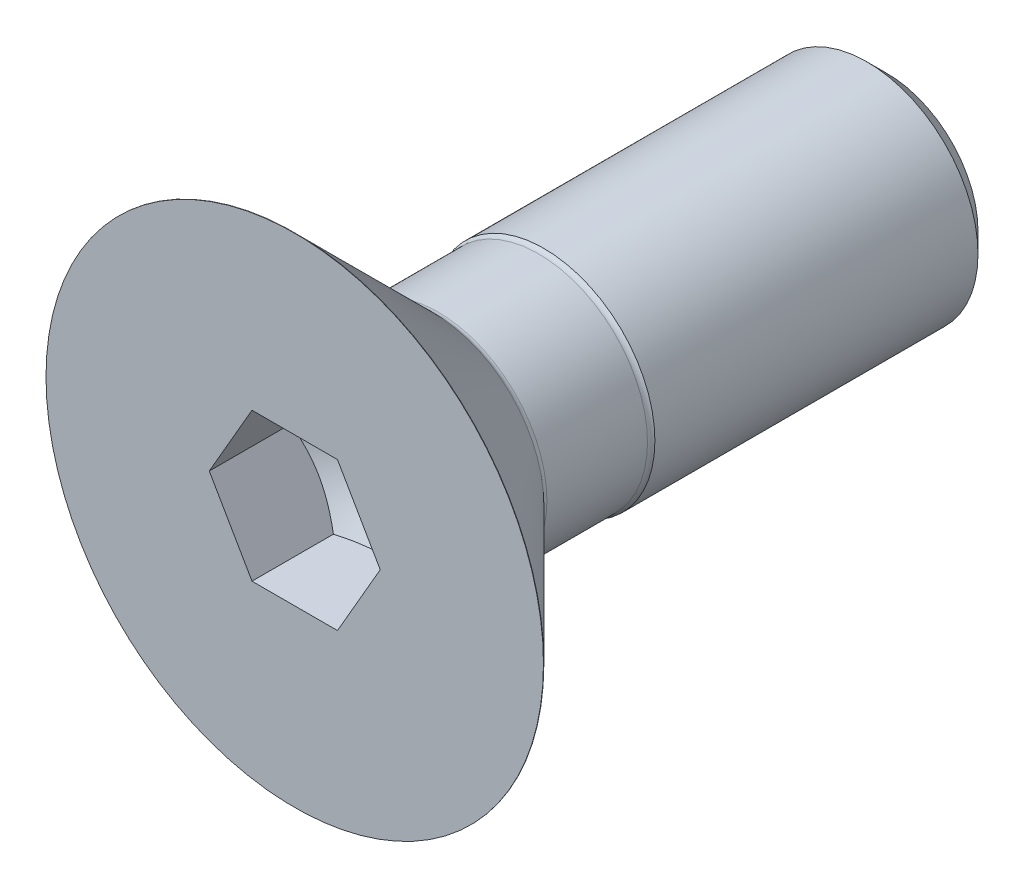
ISO-10303-21;
HEADER;
FILE_DESCRIPTION(('STEP AP214'),'2;1');
FILE_NAME('part.step','',(''),(''),'','','');
FILE_SCHEMA(('AUTOMOTIVE_DESIGN { 1 0 10303 214 1 1 1 1 }'));
ENDSEC;
DATA;
#1=APPLICATION_CONTEXT('core data for automotive mechanical design processes');
#2=APPLICATION_PROTOCOL_DEFINITION('international standard','automotive_design',2000,#1);
#3=PRODUCT_CONTEXT('',#1,'mechanical');
#4=PRODUCT('Part','Part','',(#3));
#5=PRODUCT_RELATED_PRODUCT_CATEGORY('part','',(#4));
#6=PRODUCT_DEFINITION_FORMATION('','',#4);
#7=PRODUCT_DEFINITION_CONTEXT('part definition',#1,'design');
#8=PRODUCT_DEFINITION('design','',#6,#7);
#9=PRODUCT_DEFINITION_SHAPE('','',#8);
#10=(LENGTH_UNIT() NAMED_UNIT(*) SI_UNIT(.MILLI.,.METRE.));
#11=(NAMED_UNIT(*) PLANE_ANGLE_UNIT() SI_UNIT($,.RADIAN.));
#12=(NAMED_UNIT(*) SI_UNIT($,.STERADIAN.) SOLID_ANGLE_UNIT());
#13=UNCERTAINTY_MEASURE_WITH_UNIT(LENGTH_MEASURE(1.E-05),#10,'distance_accuracy_value','');
#14=(GEOMETRIC_REPRESENTATION_CONTEXT(3) GLOBAL_UNCERTAINTY_ASSIGNED_CONTEXT((#13)) GLOBAL_UNIT_ASSIGNED_CONTEXT((#10,
#11,#12)) REPRESENTATION_CONTEXT('',''));
#15=CARTESIAN_POINT('',(0.,0.,0.));
#16=DIRECTION('',(0.,0.,1.));
#17=DIRECTION('',(1.,0.,0.));
#18=AXIS2_PLACEMENT_3D('',#15,#16,#17);
#19=CARTESIAN_POINT('',(0.,6.72,0.));
#20=DIRECTION('',(0.,0.,-1.));
#21=DIRECTION('',(-1.,0.,0.));
#22=AXIS2_PLACEMENT_3D('',#19,#20,#21);
#23=PLANE('',#22);
#24=CARTESIAN_POINT('',(0.,0.,0.));
#25=DIRECTION('',(0.,0.,1.));
#26=DIRECTION('',(1.,0.,0.));
#27=AXIS2_PLACEMENT_3D('',#24,#25,#26);
#28=CIRCLE('',#27,6.72);
#29=CARTESIAN_POINT('',(6.72,0.,0.));
#30=VERTEX_POINT('',#29);
#31=EDGE_CURVE('E107',#30,#30,#28,.T.);
#32=ORIENTED_EDGE('',*,*,#31,.T.);
#33=EDGE_LOOP('',(#32));
#34=FACE_BOUND('',#33,.T.);
#35=DIRECTION('',(0.5,-0.866025403784439,0.));
#36=VECTOR('',#35,1.);
#37=CARTESIAN_POINT('',(1.1547,1.99999906749978,0.));
#38=LINE('',#37,#36);
#39=CARTESIAN_POINT('',(1.1547,1.99999906749978,0.));
#40=VERTEX_POINT('',#39);
#41=CARTESIAN_POINT('',(2.3094,0.,0.));
#42=VERTEX_POINT('',#41);
#43=EDGE_CURVE('E31',#40,#42,#38,.T.);
#44=ORIENTED_EDGE('',*,*,#43,.T.);
#45=DIRECTION('',(-0.5,-0.866025403784439,0.));
#46=VECTOR('',#45,1.);
#47=CARTESIAN_POINT('',(2.3094,0.,0.));
#48=LINE('',#47,#46);
#49=CARTESIAN_POINT('',(1.1547,-1.99999906749978,0.));
#50=VERTEX_POINT('',#49);
#51=EDGE_CURVE('E181',#42,#50,#48,.T.);
#52=ORIENTED_EDGE('',*,*,#51,.T.);
#53=DIRECTION('',(-1.,0.,0.));
#54=VECTOR('',#53,1.);
#55=CARTESIAN_POINT('',(1.1547,-1.99999906749978,0.));
#56=LINE('',#55,#54);
#57=CARTESIAN_POINT('',(-1.1547,-1.99999906749978,0.));
#58=VERTEX_POINT('',#57);
#59=EDGE_CURVE('E232',#50,#58,#56,.T.);
#60=ORIENTED_EDGE('',*,*,#59,.T.);
#61=DIRECTION('',(-0.5,0.866025403784439,0.));
#62=VECTOR('',#61,1.);
#63=CARTESIAN_POINT('',(-1.1547,-1.99999906749978,0.));
#64=LINE('',#63,#62);
#65=CARTESIAN_POINT('',(-2.3094,0.,0.));
#66=VERTEX_POINT('',#65);
#67=EDGE_CURVE('E230',#58,#66,#64,.T.);
#68=ORIENTED_EDGE('',*,*,#67,.T.);
#69=DIRECTION('',(0.5,0.866025403784439,0.));
#70=VECTOR('',#69,1.);
#71=CARTESIAN_POINT('',(-2.3094,0.,0.));
#72=LINE('',#71,#70);
#73=CARTESIAN_POINT('',(-1.1547,1.99999906749978,0.));
#74=VERTEX_POINT('',#73);
#75=EDGE_CURVE('E96',#66,#74,#72,.T.);
#76=ORIENTED_EDGE('',*,*,#75,.T.);
#77=DIRECTION('',(1.,0.,0.));
#78=VECTOR('',#77,1.);
#79=CARTESIAN_POINT('',(-1.1547,1.99999906749978,0.));
#80=LINE('',#79,#78);
#81=EDGE_CURVE('E92',#74,#40,#80,.T.);
#82=ORIENTED_EDGE('',*,*,#81,.T.);
#83=EDGE_LOOP('',(#44,#52,#60,#68,#76,#82));
#84=FACE_BOUND('',#83,.T.);
#85=ADVANCED_FACE('F17',(#34,#84),#23,.F.);
#86=CARTESIAN_POINT('',(0.,0.,-16.));
#87=DIRECTION('',(0.,0.,1.));
#88=DIRECTION('',(1.,0.,0.));
#89=AXIS2_PLACEMENT_3D('',#86,#87,#88);
#90=PLANE('',#89);
#91=CARTESIAN_POINT('',(0.,0.,-16.));
#92=DIRECTION('',(0.,0.,1.));
#93=DIRECTION('',(1.,0.,0.));
#94=AXIS2_PLACEMENT_3D('',#91,#92,#93);
#95=CIRCLE('',#94,2.45875);
#96=CARTESIAN_POINT('',(2.45875,0.,-16.));
#97=VERTEX_POINT('',#96);
#98=EDGE_CURVE('E11',#97,#97,#95,.T.);
#99=ORIENTED_EDGE('',*,*,#98,.F.);
#100=EDGE_LOOP('',(#99));
#101=FACE_BOUND('',#100,.T.);
#102=ADVANCED_FACE('F132',(#101),#90,.F.);
#103=CARTESIAN_POINT('',(0.,0.,-16.));
#104=DIRECTION('',(0.,0.,1.));
#105=DIRECTION('',(1.,0.,0.));
#106=AXIS2_PLACEMENT_3D('',#103,#104,#105);
#107=CONICAL_SURFACE('',#106,2.45875,0.785398163397448);
#108=CARTESIAN_POINT('',(0.,0.,-15.45875));
#109=DIRECTION('',(0.,0.,1.));
#110=DIRECTION('',(1.,0.,0.));
#111=AXIS2_PLACEMENT_3D('',#108,#109,#110);
#112=CIRCLE('',#111,3.);
#113=CARTESIAN_POINT('',(3.,0.,-15.45875));
#114=VERTEX_POINT('',#113);
#115=EDGE_CURVE('E24',#114,#114,#112,.T.);
#116=ORIENTED_EDGE('',*,*,#115,.F.);
#117=EDGE_LOOP('',(#116));
#118=FACE_BOUND('',#117,.T.);
#119=ORIENTED_EDGE('',*,*,#98,.T.);
#120=EDGE_LOOP('',(#119));
#121=FACE_BOUND('',#120,.T.);
#122=ADVANCED_FACE('F129',(#118,#121),#107,.T.);
#123=CARTESIAN_POINT('',(0.,0.,0.));
#124=DIRECTION('',(0.,0.,1.));
#125=DIRECTION('',(1.,0.,0.));
#126=AXIS2_PLACEMENT_3D('',#123,#124,#125);
#127=CYLINDRICAL_SURFACE('',#126,3.);
#128=CARTESIAN_POINT('',(0.,0.,-6.73));
#129=DIRECTION('',(0.,0.,1.));
#130=DIRECTION('',(1.,0.,0.));
#131=AXIS2_PLACEMENT_3D('',#128,#129,#130);
#132=CIRCLE('',#131,3.);
#133=CARTESIAN_POINT('',(3.,0.,-6.73));
#134=VERTEX_POINT('',#133);
#135=EDGE_CURVE('E122',#134,#134,#132,.T.);
#136=ORIENTED_EDGE('',*,*,#135,.F.);
#137=EDGE_LOOP('',(#136));
#138=FACE_BOUND('',#137,.T.);
#139=ORIENTED_EDGE('',*,*,#115,.T.);
#140=EDGE_LOOP('',(#139));
#141=FACE_BOUND('',#140,.T.);
#142=ADVANCED_FACE('F127',(#138,#141),#127,.T.);
#143=CARTESIAN_POINT('',(0.,0.,-6.58857864376269));
#144=DIRECTION('',(0.,0.,1.));
#145=DIRECTION('',(1.,0.,0.));
#146=AXIS2_PLACEMENT_3D('',#143,#144,#145);
#147=TOROIDAL_SURFACE('',#146,3.14142135623731,0.2);
#148=ORIENTED_EDGE('',*,*,#135,.T.);
#149=EDGE_LOOP('',(#148));
#150=FACE_BOUND('',#149,.T.);
#151=CARTESIAN_POINT('',(0.,0.,-6.58857864376269));
#152=DIRECTION('',(0.,0.,1.));
#153=DIRECTION('',(1.,0.,0.));
#154=AXIS2_PLACEMENT_3D('',#151,#152,#153);
#155=CIRCLE('',#154,2.94142135623731);
#156=CARTESIAN_POINT('',(2.94142135623731,0.,-6.58857864376269));
#157=VERTEX_POINT('',#156);
#158=EDGE_CURVE('E119',#157,#157,#155,.T.);
#159=ORIENTED_EDGE('',*,*,#158,.F.);
#160=EDGE_LOOP('',(#159));
#161=FACE_BOUND('',#160,.T.);
#162=ADVANCED_FACE('F145',(#150,#161),#147,.F.);
#163=CARTESIAN_POINT('',(0.,0.,0.));
#164=DIRECTION('',(0.,0.,1.));
#165=DIRECTION('',(1.,0.,0.));
#166=AXIS2_PLACEMENT_3D('',#163,#164,#165);
#167=CYLINDRICAL_SURFACE('',#166,2.94142135623731);
#168=CARTESIAN_POINT('',(0.,0.,-3.87142135623731));
#169=DIRECTION('',(0.,0.,1.));
#170=DIRECTION('',(1.,0.,0.));
#171=AXIS2_PLACEMENT_3D('',#168,#169,#170);
#172=CIRCLE('',#171,2.94142135623731);
#173=CARTESIAN_POINT('',(2.94142135623731,0.,-3.87142135623731));
#174=VERTEX_POINT('',#173);
#175=EDGE_CURVE('E116',#174,#174,#172,.T.);
#176=ORIENTED_EDGE('',*,*,#175,.F.);
#177=EDGE_LOOP('',(#176));
#178=FACE_BOUND('',#177,.T.);
#179=ORIENTED_EDGE('',*,*,#158,.T.);
#180=EDGE_LOOP('',(#179));
#181=FACE_BOUND('',#180,.T.);
#182=ADVANCED_FACE('F149',(#178,#181),#167,.T.);
#183=CARTESIAN_POINT('',(0.,0.,-3.87142135623731));
#184=DIRECTION('',(0.,0.,1.));
#185=DIRECTION('',(1.,0.,0.));
#186=AXIS2_PLACEMENT_3D('',#183,#184,#185);
#187=TOROIDAL_SURFACE('',#186,3.14142135623731,0.2);
#188=ORIENTED_EDGE('',*,*,#175,.T.);
#189=EDGE_LOOP('',(#188));
#190=FACE_BOUND('',#189,.T.);
#191=CARTESIAN_POINT('',(0.,0.,-3.73));
#192=DIRECTION('',(0.,0.,1.));
#193=DIRECTION('',(1.,0.,0.));
#194=AXIS2_PLACEMENT_3D('',#191,#192,#193);
#195=CIRCLE('',#194,3.);
#196=CARTESIAN_POINT('',(3.,0.,-3.73));
#197=VERTEX_POINT('',#196);
#198=EDGE_CURVE('E113',#197,#197,#195,.T.);
#199=ORIENTED_EDGE('',*,*,#198,.F.);
#200=EDGE_LOOP('',(#199));
#201=FACE_BOUND('',#200,.T.);
#202=ADVANCED_FACE('F153',(#190,#201),#187,.F.);
#203=CARTESIAN_POINT('',(0.,0.,-3.73));
#204=DIRECTION('',(0.,0.,1.));
#205=DIRECTION('',(1.,0.,0.));
#206=AXIS2_PLACEMENT_3D('',#203,#204,#205);
#207=CONICAL_SURFACE('',#206,3.,0.785398163397448);
#208=CARTESIAN_POINT('',(0.,0.,-0.0100000000000002));
#209=DIRECTION('',(0.,0.,1.));
#210=DIRECTION('',(1.,0.,0.));
#211=AXIS2_PLACEMENT_3D('',#208,#209,#210);
#212=CIRCLE('',#211,6.72);
#213=CARTESIAN_POINT('',(6.72,0.,-0.00999999999999981));
#214=VERTEX_POINT('',#213);
#215=EDGE_CURVE('E110',#214,#214,#212,.T.);
#216=ORIENTED_EDGE('',*,*,#215,.F.);
#217=EDGE_LOOP('',(#216));
#218=FACE_BOUND('',#217,.T.);
#219=ORIENTED_EDGE('',*,*,#198,.T.);
#220=EDGE_LOOP('',(#219));
#221=FACE_BOUND('',#220,.T.);
#222=ADVANCED_FACE('F157',(#218,#221),#207,.T.);
#223=CARTESIAN_POINT('',(0.,0.,0.));
#224=DIRECTION('',(0.,0.,1.));
#225=DIRECTION('',(1.,0.,0.));
#226=AXIS2_PLACEMENT_3D('',#223,#224,#225);
#227=CYLINDRICAL_SURFACE('',#226,6.72);
#228=ORIENTED_EDGE('',*,*,#31,.F.);
#229=EDGE_LOOP('',(#228));
#230=FACE_BOUND('',#229,.T.);
#231=ORIENTED_EDGE('',*,*,#215,.T.);
#232=EDGE_LOOP('',(#231));
#233=FACE_BOUND('',#232,.T.);
#234=ADVANCED_FACE('F161',(#230,#233),#227,.T.);
#235=CARTESIAN_POINT('',(1.1547,1.99999906749978,-3.53333271166652));
#236=DIRECTION('',(-0.866025403784439,-0.5,0.));
#237=DIRECTION('',(-0.5,0.866025403784439,0.));
#238=AXIS2_PLACEMENT_3D('',#235,#236,#237);
#239=PLANE('',#238);
#240=DIRECTION('',(0.,0.,1.));
#241=VECTOR('',#240,1.);
#242=CARTESIAN_POINT('',(2.3094,0.,-3.53333271166652));
#243=LINE('',#242,#241);
#244=CARTESIAN_POINT('',(2.3094,0.,-2.2));
#245=VERTEX_POINT('',#244);
#246=EDGE_CURVE('E105',#245,#42,#243,.T.);
#247=ORIENTED_EDGE('',*,*,#246,.T.);
#248=ORIENTED_EDGE('',*,*,#43,.F.);
#249=DIRECTION('',(0.,0.,1.));
#250=VECTOR('',#249,1.);
#251=CARTESIAN_POINT('',(1.1547,1.99999906749978,-3.53333271166652));
#252=LINE('',#251,#250);
#253=CARTESIAN_POINT('',(1.1547,1.99999906749978,-2.2));
#254=VERTEX_POINT('',#253);
#255=EDGE_CURVE('E86',#254,#40,#252,.T.);
#256=ORIENTED_EDGE('',*,*,#255,.F.);
#257=CARTESIAN_POINT('',(2.30940011547005,-2.00000000136643E-07,-2.19999993333333));
#258=CARTESIAN_POINT('',(2.25865804163694,0.0878876499603635,-2.22930438001918));
#259=CARTESIAN_POINT('',(2.20747796294866,0.176534146583836,-2.25595524143582));
#260=CARTESIAN_POINT('',(2.10423165658607,0.355361994897665,-2.30247352151799));
#261=CARTESIAN_POINT('',(2.0521635950207,0.445546522980521,-2.32232448557226));
#262=CARTESIAN_POINT('',(1.94867272533426,0.624797967396913,-2.35322394490835));
#263=CARTESIAN_POINT('',(1.89726583615742,0.713837311310268,-2.36447811715131));
#264=CARTESIAN_POINT('',(1.79421029737332,0.892334740485717,-2.37791074222417));
#265=CARTESIAN_POINT('',(1.74256202208837,0.981792177402555,-2.38010032109286));
#266=CARTESIAN_POINT('',(1.64606274519206,1.14893382788061,-2.37553363610139));
#267=CARTESIAN_POINT('',(1.60119726314119,1.2266431222988,-2.36989864477568));
#268=CARTESIAN_POINT('',(1.51175858304607,1.38155546038545,-2.35204263459261));
#269=CARTESIAN_POINT('',(1.46718569411587,1.45875796865268,-2.33981552211608));
#270=CARTESIAN_POINT('',(1.37756276162779,1.61398944124535,-2.30925010491567));
#271=CARTESIAN_POINT('',(1.3325240553501,1.69199876882547,-2.29078229572568));
#272=CARTESIAN_POINT('',(1.2431182011445,1.84685425080366,-2.24886817541632));
#273=CARTESIAN_POINT('',(1.19874990870617,1.92370238755192,-2.22543170613741));
#274=CARTESIAN_POINT('',(1.15469988452994,1.99999926749979,-2.19999993333333));
#275=B_SPLINE_CURVE_WITH_KNOTS('',3,(#257,#258,#259,#260,#261,#262,#263,#264,#265,#266,#267,
#268,#269,#270,#271,#272,#273,#274),.UNSPECIFIED.,.F.,.F.,(4,2,2,2,2,2,2,2,4),(0.,
0.317015879560132,0.634793553111488,0.944707212041052,1.25424036459456,1.52370723489002,
1.79342362288273,2.06912103104562,2.3442773610271),.UNSPECIFIED.);
#276=EDGE_CURVE('E79',#245,#254,#275,.T.);
#277=ORIENTED_EDGE('',*,*,#276,.F.);
#278=EDGE_LOOP('',(#247,#248,#256,#277));
#279=FACE_BOUND('',#278,.T.);
#280=ADVANCED_FACE('F87',(#279),#239,.T.);
#281=CARTESIAN_POINT('',(2.3094,0.,-3.53333271166652));
#282=DIRECTION('',(-0.866025403784439,0.5,0.));
#283=DIRECTION('',(0.5,0.866025403784439,0.));
#284=AXIS2_PLACEMENT_3D('',#281,#282,#283);
#285=PLANE('',#284);
#286=DIRECTION('',(0.,0.,1.));
#287=VECTOR('',#286,1.);
#288=CARTESIAN_POINT('',(1.1547,-1.99999906749978,-3.53333271166652));
#289=LINE('',#288,#287);
#290=CARTESIAN_POINT('',(1.1547,-1.99999906749978,-2.2));
#291=VERTEX_POINT('',#290);
#292=EDGE_CURVE('E103',#291,#50,#289,.T.);
#293=ORIENTED_EDGE('',*,*,#292,.T.);
#294=ORIENTED_EDGE('',*,*,#51,.F.);
#295=ORIENTED_EDGE('',*,*,#246,.F.);
#296=CARTESIAN_POINT('',(1.15469988452995,-1.99999926749979,-2.19999993333333));
#297=CARTESIAN_POINT('',(1.20544195836306,-1.91211141753942,-2.22930438001918));
#298=CARTESIAN_POINT('',(1.25662203705134,-1.82346492091595,-2.25595524143582));
#299=CARTESIAN_POINT('',(1.35986834341393,-1.64463707260212,-2.30247352151799));
#300=CARTESIAN_POINT('',(1.41193640497931,-1.55445254451926,-2.32232448557226));
#301=CARTESIAN_POINT('',(1.51542727466574,-1.37520110010287,-2.35322394490835));
#302=CARTESIAN_POINT('',(1.56683416384258,-1.28616175618951,-2.36447811715131));
#303=CARTESIAN_POINT('',(1.66988970262668,-1.10766432701407,-2.37791074222417));
#304=CARTESIAN_POINT('',(1.72153797791163,-1.01820689009723,-2.38010032109286));
#305=CARTESIAN_POINT('',(1.81803725480794,-0.851065239619172,-2.37553363610139));
#306=CARTESIAN_POINT('',(1.86290273685881,-0.773355945200988,-2.36989864477568));
#307=CARTESIAN_POINT('',(1.95234141695394,-0.618443607114335,-2.35204263459261));
#308=CARTESIAN_POINT('',(1.99691430588413,-0.541241098847107,-2.33981552211608));
#309=CARTESIAN_POINT('',(2.08653723837221,-0.386009626254437,-2.30925010491567));
#310=CARTESIAN_POINT('',(2.1315759446499,-0.308000298674311,-2.29078229572568));
#311=CARTESIAN_POINT('',(2.2209817988555,-0.153144816696122,-2.24886817541632));
#312=CARTESIAN_POINT('',(2.26535009129383,-0.0762966799478616,-2.22543170613741));
#313=CARTESIAN_POINT('',(2.30940011547005,1.99999999731095E-07,-2.19999993333333));
#314=B_SPLINE_CURVE_WITH_KNOTS('',3,(#296,#297,#298,#299,#300,#301,#302,#303,#304,#305,#306,
#307,#308,#309,#310,#311,#312,#313),.UNSPECIFIED.,.F.,.F.,(4,2,2,2,2,2,2,2,4),(0.,
0.317015879560132,0.634793553111489,0.944707212041054,1.25424036459457,1.52370723489002,
1.79342362288273,2.06912103104562,2.3442773610271),.UNSPECIFIED.);
#315=EDGE_CURVE('E83',#291,#245,#314,.T.);
#316=ORIENTED_EDGE('',*,*,#315,.F.);
#317=EDGE_LOOP('',(#293,#294,#295,#316));
#318=FACE_BOUND('',#317,.T.);
#319=ADVANCED_FACE('F169',(#318),#285,.T.);
#320=CARTESIAN_POINT('',(1.1547,-1.99999906749978,-3.53333271166652));
#321=DIRECTION('',(0.,1.,0.));
#322=DIRECTION('',(1.,0.,0.));
#323=AXIS2_PLACEMENT_3D('',#320,#321,#322);
#324=PLANE('',#323);
#325=DIRECTION('',(0.,0.,1.));
#326=VECTOR('',#325,1.);
#327=CARTESIAN_POINT('',(-1.1547,-1.99999906749978,-3.53333271166652));
#328=LINE('',#327,#326);
#329=CARTESIAN_POINT('',(-1.1547,-1.99999906749978,-2.2));
#330=VERTEX_POINT('',#329);
#331=EDGE_CURVE('E101',#330,#58,#328,.T.);
#332=ORIENTED_EDGE('',*,*,#331,.T.);
#333=ORIENTED_EDGE('',*,*,#59,.F.);
#334=ORIENTED_EDGE('',*,*,#292,.F.);
#335=CARTESIAN_POINT('',(-2.99028884971983,-1.99999906749978,-1.45632976874141));
#336=CARTESIAN_POINT('',(-2.90317192954768,-1.99999906749978,-1.49812480933084));
#337=CARTESIAN_POINT('',(-2.81584104887546,-1.99999906749978,-1.53948238702468));
#338=CARTESIAN_POINT('',(-2.64063562621548,-1.99999906749978,-1.6210714673542));
#339=CARTESIAN_POINT('',(-2.55276098561855,-1.99999906749978,-1.66130275797122));
#340=CARTESIAN_POINT('',(-2.3758459290809,-1.99999906749978,-1.74061387059958));
#341=CARTESIAN_POINT('',(-2.28680167074422,-1.99999906749978,-1.77968515426293));
#342=CARTESIAN_POINT('',(-2.10795626459954,-1.99999906749978,-1.8560483067501));
#343=CARTESIAN_POINT('',(-2.01815515904986,-1.99999906749978,-1.89334027415713));
#344=CARTESIAN_POINT('',(-1.83686369803778,-1.99999906749978,-1.96598174556176));
#345=CARTESIAN_POINT('',(-1.74536545015741,-1.99999906749978,-2.00131166554563));
#346=CARTESIAN_POINT('',(-1.56126782972996,-1.99999906749978,-2.06903330723792));
#347=CARTESIAN_POINT('',(-1.46866833414098,-1.99999906749978,-2.10142469707008));
#348=CARTESIAN_POINT('',(-1.28243840910671,-1.99999906749978,-2.16235094632888));
#349=CARTESIAN_POINT('',(-1.18881093628898,-1.99999906749978,-2.19089474663683));
#350=CARTESIAN_POINT('',(-1.00022528510181,-1.99999906749978,-2.24316330910459));
#351=CARTESIAN_POINT('',(-0.905267434268475,-1.99999906749978,-2.2668892358774));
#352=CARTESIAN_POINT('',(-0.71371686247379,-1.99999906749978,-2.30838466009041));
#353=CARTESIAN_POINT('',(-0.617119901359724,-1.99999906749978,-2.3261349671684));
#354=CARTESIAN_POINT('',(-0.422840621533437,-1.99999906749978,-2.3543547873961));
#355=CARTESIAN_POINT('',(-0.325158287357262,-1.99999906749978,-2.36482419667504));
#356=CARTESIAN_POINT('',(-0.129781227715793,-1.99999906749978,-2.37755247517898));
#357=CARTESIAN_POINT('',(-0.0320894989376912,-1.99999906749978,-2.37985598893891));
#358=CARTESIAN_POINT('',(0.163106073832241,-1.99999906749978,-2.37617096347604));
#359=CARTESIAN_POINT('',(0.260609954526481,-1.99999906749978,-2.37018425389091));
#360=CARTESIAN_POINT('',(0.500844677803156,-1.99999906749979,-2.34575235143088));
#361=CARTESIAN_POINT('',(0.643111843239373,-1.99999906749978,-2.32274770156855));
#362=CARTESIAN_POINT('',(0.925045656572312,-1.99999906749978,-2.26338671553501));
#363=CARTESIAN_POINT('',(1.06470522750172,-1.99999906749978,-2.22699840223935));
#364=CARTESIAN_POINT('',(1.27351689709034,-1.99999906749978,-2.16485405999544));
#365=CARTESIAN_POINT('',(1.34375129930193,-1.99999906749978,-2.1426001724973));
#366=CARTESIAN_POINT('',(1.4835379497356,-1.99999906749978,-2.09601824647059));
#367=CARTESIAN_POINT('',(1.55309013895772,-1.99999906749978,-2.07169003028058));
#368=CARTESIAN_POINT('',(1.691168485488,-1.99999906749978,-2.02147021927775));
#369=CARTESIAN_POINT('',(1.75969824693065,-1.99999906749978,-1.99558845119335));
#370=CARTESIAN_POINT('',(1.89618572582459,-1.99999906749978,-1.9424205680443));
#371=CARTESIAN_POINT('',(1.96414362519705,-1.99999906749978,-1.91513492087758));
#372=CARTESIAN_POINT('',(2.03186196225563,-1.99999906749978,-1.88728094013752));
#373=B_SPLINE_CURVE_WITH_KNOTS('',3,(#335,#336,#337,#338,#339,#340,#341,#342,#343,#344,#345,
#346,#347,#348,#349,#350,#351,#352,#353,#354,#355,#356,#357,#358,#359,#360,#361,#362,#363,#364,
#365,#366,#367,#368,#369,#370,#371,#372),.UNSPECIFIED.,.F.,.F.,(4,2,2,2,2,2,2,2,2,2,2,2,2,2,2,2,
2,2,4),(0.,0.289876061969081,0.57980632984516,0.871508240389853,1.16319397034828,
1.45740181544444,1.75164284698201,2.04518789048354,2.33866189135616,2.63306957158504,
2.92748145180718,3.22028122132952,3.513016380757,3.94447373733503,4.37696872859974,
4.59797161317252,4.81899344518056,5.03874045142066,5.25841468685787),.UNSPECIFIED.);
#374=EDGE_CURVE('E206',#330,#291,#373,.T.);
#375=ORIENTED_EDGE('',*,*,#374,.F.);
#376=EDGE_LOOP('',(#332,#333,#334,#375));
#377=FACE_BOUND('',#376,.T.);
#378=ADVANCED_FACE('F210',(#377),#324,.T.);
#379=CARTESIAN_POINT('',(-1.1547,-1.99999906749978,-3.53333271166652));
#380=DIRECTION('',(0.866025403784439,0.5,0.));
#381=DIRECTION('',(0.5,-0.866025403784439,0.));
#382=AXIS2_PLACEMENT_3D('',#379,#380,#381);
#383=PLANE('',#382);
#384=DIRECTION('',(0.,0.,1.));
#385=VECTOR('',#384,1.);
#386=CARTESIAN_POINT('',(-2.3094,0.,-3.53333271166652));
#387=LINE('',#386,#385);
#388=CARTESIAN_POINT('',(-2.3094,0.,-2.2));
#389=VERTEX_POINT('',#388);
#390=EDGE_CURVE('E94',#389,#66,#387,.T.);
#391=ORIENTED_EDGE('',*,*,#390,.T.);
#392=ORIENTED_EDGE('',*,*,#67,.F.);
#393=ORIENTED_EDGE('',*,*,#331,.F.);
#394=CARTESIAN_POINT('',(-2.30940011547005,2.00000000666134E-07,-2.19999993333333));
#395=CARTESIAN_POINT('',(-2.25865804163694,-0.0878876499603631,-2.22930438001918));
#396=CARTESIAN_POINT('',(-2.20747796294866,-0.176534146583836,-2.25595524143582));
#397=CARTESIAN_POINT('',(-2.10423165658607,-0.355361994897664,-2.30247352151799));
#398=CARTESIAN_POINT('',(-2.0521635950207,-0.445546522980521,-2.32232448557226));
#399=CARTESIAN_POINT('',(-1.94867272533426,-0.624797967396914,-2.35322394490835));
#400=CARTESIAN_POINT('',(-1.89726583615742,-0.713837311310269,-2.36447811715131));
#401=CARTESIAN_POINT('',(-1.79421029737332,-0.892334740485717,-2.37791074222417));
#402=CARTESIAN_POINT('',(-1.74256202208837,-0.981792177402555,-2.38010032109286));
#403=CARTESIAN_POINT('',(-1.64606274519206,-1.14893382788061,-2.37553363610139));
#404=CARTESIAN_POINT('',(-1.60119726314119,-1.22664312229879,-2.36989864477568));
#405=CARTESIAN_POINT('',(-1.51175858304607,-1.38155546038545,-2.35204263459261));
#406=CARTESIAN_POINT('',(-1.46718569411587,-1.45875796865268,-2.33981552211608));
#407=CARTESIAN_POINT('',(-1.37756276162779,-1.61398944124535,-2.30925010491567));
#408=CARTESIAN_POINT('',(-1.3325240553501,-1.69199876882547,-2.29078229572568));
#409=CARTESIAN_POINT('',(-1.2431182011445,-1.84685425080366,-2.24886817541632));
#410=CARTESIAN_POINT('',(-1.19874990870617,-1.92370238755192,-2.22543170613741));
#411=CARTESIAN_POINT('',(-1.15469988452995,-1.99999926749979,-2.19999993333333));
#412=B_SPLINE_CURVE_WITH_KNOTS('',3,(#394,#395,#396,#397,#398,#399,#400,#401,#402,#403,#404,
#405,#406,#407,#408,#409,#410,#411),.UNSPECIFIED.,.F.,.F.,(4,2,2,2,2,2,2,2,4),(0.,
0.317015879560132,0.634793553111489,0.944707212041053,1.25424036459456,1.52370723489002,
1.79342362288273,2.06912103104562,2.3442773610271),.UNSPECIFIED.);
#413=EDGE_CURVE('E201',#389,#330,#412,.T.);
#414=ORIENTED_EDGE('',*,*,#413,.F.);
#415=EDGE_LOOP('',(#391,#392,#393,#414));
#416=FACE_BOUND('',#415,.T.);
#417=ADVANCED_FACE('F213',(#416),#383,.T.);
#418=CARTESIAN_POINT('',(-2.3094,0.,-3.53333271166652));
#419=DIRECTION('',(0.866025403784439,-0.5,0.));
#420=DIRECTION('',(-0.5,-0.866025403784439,0.));
#421=AXIS2_PLACEMENT_3D('',#418,#419,#420);
#422=PLANE('',#421);
#423=DIRECTION('',(0.,0.,1.));
#424=VECTOR('',#423,1.);
#425=CARTESIAN_POINT('',(-1.1547,1.99999906749978,-3.53333271166652));
#426=LINE('',#425,#424);
#427=CARTESIAN_POINT('',(-1.1547,1.99999906749978,-2.2));
#428=VERTEX_POINT('',#427);
#429=EDGE_CURVE('E91',#428,#74,#426,.T.);
#430=ORIENTED_EDGE('',*,*,#429,.T.);
#431=ORIENTED_EDGE('',*,*,#75,.F.);
#432=ORIENTED_EDGE('',*,*,#390,.F.);
#433=CARTESIAN_POINT('',(-1.15469988452995,1.99999926749978,-2.19999993333333));
#434=CARTESIAN_POINT('',(-1.20544195836306,1.91211141753942,-2.22930438001918));
#435=CARTESIAN_POINT('',(-1.25662203705134,1.82346492091594,-2.25595524143582));
#436=CARTESIAN_POINT('',(-1.35986834341393,1.64463707260212,-2.30247352151799));
#437=CARTESIAN_POINT('',(-1.41193640497931,1.55445254451926,-2.32232448557226));
#438=CARTESIAN_POINT('',(-1.51542727466574,1.37520110010287,-2.35322394490835));
#439=CARTESIAN_POINT('',(-1.56683416384258,1.28616175618951,-2.36447811715131));
#440=CARTESIAN_POINT('',(-1.66988970262668,1.10766432701406,-2.37791074222417));
#441=CARTESIAN_POINT('',(-1.72153797791163,1.01820689009723,-2.38010032109286));
#442=CARTESIAN_POINT('',(-1.81803725480794,0.851065239619171,-2.37553363610139));
#443=CARTESIAN_POINT('',(-1.86290273685881,0.773355945200987,-2.36989864477568));
#444=CARTESIAN_POINT('',(-1.95234141695394,0.618443607114335,-2.35204263459261));
#445=CARTESIAN_POINT('',(-1.99691430588413,0.541241098847106,-2.33981552211608));
#446=CARTESIAN_POINT('',(-2.08653723837221,0.386009626254437,-2.30925010491567));
#447=CARTESIAN_POINT('',(-2.1315759446499,0.308000298674311,-2.29078229572568));
#448=CARTESIAN_POINT('',(-2.2209817988555,0.153144816696123,-2.24886817541632));
#449=CARTESIAN_POINT('',(-2.26535009129383,0.0762966799478618,-2.22543170613741));
#450=CARTESIAN_POINT('',(-2.30940011547005,-1.99999999188908E-07,-2.19999993333333));
#451=B_SPLINE_CURVE_WITH_KNOTS('',3,(#433,#434,#435,#436,#437,#438,#439,#440,#441,#442,#443,
#444,#445,#446,#447,#448,#449,#450),.UNSPECIFIED.,.F.,.F.,(4,2,2,2,2,2,2,2,4),(0.,
0.317015879560131,0.634793553111488,0.944707212041051,1.25424036459456,1.52370723489002,
1.79342362288273,2.06912103104562,2.34427736102709),.UNSPECIFIED.);
#452=EDGE_CURVE('E39',#428,#389,#451,.T.);
#453=ORIENTED_EDGE('',*,*,#452,.F.);
#454=EDGE_LOOP('',(#430,#431,#432,#453));
#455=FACE_BOUND('',#454,.T.);
#456=ADVANCED_FACE('F217',(#455),#422,.T.);
#457=CARTESIAN_POINT('',(-1.1547,1.99999906749978,-3.53333271166652));
#458=DIRECTION('',(0.,-1.,0.));
#459=DIRECTION('',(-1.,0.,0.));
#460=AXIS2_PLACEMENT_3D('',#457,#458,#459);
#461=PLANE('',#460);
#462=ORIENTED_EDGE('',*,*,#255,.T.);
#463=ORIENTED_EDGE('',*,*,#81,.F.);
#464=ORIENTED_EDGE('',*,*,#429,.F.);
#465=CARTESIAN_POINT('',(-2.99028884971983,1.99999906749978,-1.45632976874141));
#466=CARTESIAN_POINT('',(-2.90317192954768,1.99999906749978,-1.49812480933084));
#467=CARTESIAN_POINT('',(-2.81584104887546,1.99999906749978,-1.53948238702468));
#468=CARTESIAN_POINT('',(-2.64063562621549,1.99999906749978,-1.6210714673542));
#469=CARTESIAN_POINT('',(-2.55276098561855,1.99999906749978,-1.66130275797122));
#470=CARTESIAN_POINT('',(-2.3758459290809,1.99999906749978,-1.74061387059958));
#471=CARTESIAN_POINT('',(-2.28680167074423,1.99999906749978,-1.77968515426292));
#472=CARTESIAN_POINT('',(-2.10795626459954,1.99999906749978,-1.8560483067501));
#473=CARTESIAN_POINT('',(-2.01815515904987,1.99999906749978,-1.89334027415713));
#474=CARTESIAN_POINT('',(-1.83686369803779,1.99999906749978,-1.96598174556176));
#475=CARTESIAN_POINT('',(-1.74536545015742,1.99999906749978,-2.00131166554563));
#476=CARTESIAN_POINT('',(-1.56126782972997,1.99999906749978,-2.06903330723792));
#477=CARTESIAN_POINT('',(-1.46866833414098,1.99999906749978,-2.10142469707008));
#478=CARTESIAN_POINT('',(-1.28243840910671,1.99999906749978,-2.16235094632888));
#479=CARTESIAN_POINT('',(-1.18881093628898,1.99999906749978,-2.19089474663683));
#480=CARTESIAN_POINT('',(-1.00022528510181,1.99999906749978,-2.24316330910459));
#481=CARTESIAN_POINT('',(-0.905267434268477,1.99999906749978,-2.2668892358774));
#482=CARTESIAN_POINT('',(-0.713716862473792,1.99999906749978,-2.30838466009041));
#483=CARTESIAN_POINT('',(-0.617119901359726,1.99999906749978,-2.3261349671684));
#484=CARTESIAN_POINT('',(-0.422840621533439,1.99999906749978,-2.3543547873961));
#485=CARTESIAN_POINT('',(-0.325158287357264,1.99999906749978,-2.36482419667504));
#486=CARTESIAN_POINT('',(-0.129781227715795,1.99999906749978,-2.37755247517898));
#487=CARTESIAN_POINT('',(-0.032089498937693,1.99999906749978,-2.37985598893891));
#488=CARTESIAN_POINT('',(0.16310607383224,1.99999906749978,-2.37617096347604));
#489=CARTESIAN_POINT('',(0.26060995452648,1.99999906749978,-2.37018425389091));
#490=CARTESIAN_POINT('',(0.500844677803155,1.99999906749979,-2.34575235143088));
#491=CARTESIAN_POINT('',(0.643111843239372,1.99999906749978,-2.32274770156855));
#492=CARTESIAN_POINT('',(0.925045656572311,1.99999906749978,-2.26338671553501));
#493=CARTESIAN_POINT('',(1.06470522750172,1.99999906749978,-2.22699840223935));
#494=CARTESIAN_POINT('',(1.27351689709034,1.99999906749978,-2.16485405999544));
#495=CARTESIAN_POINT('',(1.34375129930193,1.99999906749978,-2.1426001724973));
#496=CARTESIAN_POINT('',(1.48353794973559,1.99999906749978,-2.09601824647059));
#497=CARTESIAN_POINT('',(1.55309013895771,1.99999906749978,-2.07169003028058));
#498=CARTESIAN_POINT('',(1.691168485488,1.99999906749978,-2.02147021927775));
#499=CARTESIAN_POINT('',(1.75969824693065,1.99999906749978,-1.99558845119335));
#500=CARTESIAN_POINT('',(1.89618572582459,1.99999906749978,-1.9424205680443));
#501=CARTESIAN_POINT('',(1.96414362519705,1.99999906749978,-1.91513492087758));
#502=CARTESIAN_POINT('',(2.03186196225563,1.99999906749978,-1.88728094013752));
#503=B_SPLINE_CURVE_WITH_KNOTS('',3,(#465,#466,#467,#468,#469,#470,#471,#472,#473,#474,#475,
#476,#477,#478,#479,#480,#481,#482,#483,#484,#485,#486,#487,#488,#489,#490,#491,#492,#493,#494,
#495,#496,#497,#498,#499,#500,#501,#502),.UNSPECIFIED.,.F.,.F.,(4,2,2,2,2,2,2,2,2,2,2,2,2,2,2,2,
2,2,4),(0.,0.28987606196908,0.579806329845159,0.871508240389853,1.16319397034828,
1.45740181544444,1.75164284698201,2.04518789048354,2.33866189135617,2.63306957158505,
2.92748145180718,3.22028122132952,3.513016380757,3.94447373733503,4.37696872859974,
4.59797161317253,4.81899344518057,5.03874045142067,5.25841468685787),.UNSPECIFIED.);
#504=EDGE_CURVE('E80',#254,#428,#503,.F.);
#505=ORIENTED_EDGE('',*,*,#504,.F.);
#506=EDGE_LOOP('',(#462,#463,#464,#505));
#507=FACE_BOUND('',#506,.T.);
#508=ADVANCED_FACE('F75',(#507),#461,.T.);
#509=CARTESIAN_POINT('',(0.,0.,-3.53333271166652));
#510=DIRECTION('',(0.,0.,1.));
#511=DIRECTION('',(1.,0.,0.));
#512=AXIS2_PLACEMENT_3D('',#509,#510,#511);
#513=CONICAL_SURFACE('',#512,0.,1.0471975511966);
#514=CARTESIAN_POINT('',(0.,0.,-3.53333271166652));
#515=VERTEX_POINT('',#514);
#516=VERTEX_LOOP('',#515);
#517=FACE_BOUND('',#516,.T.);
#518=ORIENTED_EDGE('',*,*,#276,.T.);
#519=ORIENTED_EDGE('',*,*,#504,.T.);
#520=ORIENTED_EDGE('',*,*,#452,.T.);
#521=ORIENTED_EDGE('',*,*,#413,.T.);
#522=ORIENTED_EDGE('',*,*,#374,.T.);
#523=ORIENTED_EDGE('',*,*,#315,.T.);
#524=EDGE_LOOP('',(#518,#519,#520,#521,#522,#523));
#525=FACE_BOUND('',#524,.T.);
#526=ADVANCED_FACE('F72',(#517,#525),#513,.F.);
#527=CLOSED_SHELL('',(#85,#102,#122,#142,#162,#182,#202,#222,#234,#280,#319,#378,#417,#456,#508,#526));
#528=MANIFOLD_SOLID_BREP('B1',#527);
#529=ADVANCED_BREP_SHAPE_REPRESENTATION('',(#18,#528),#14);
#530=SHAPE_DEFINITION_REPRESENTATION(#9,#529);
ENDSEC;
END-ISO-10303-21;
